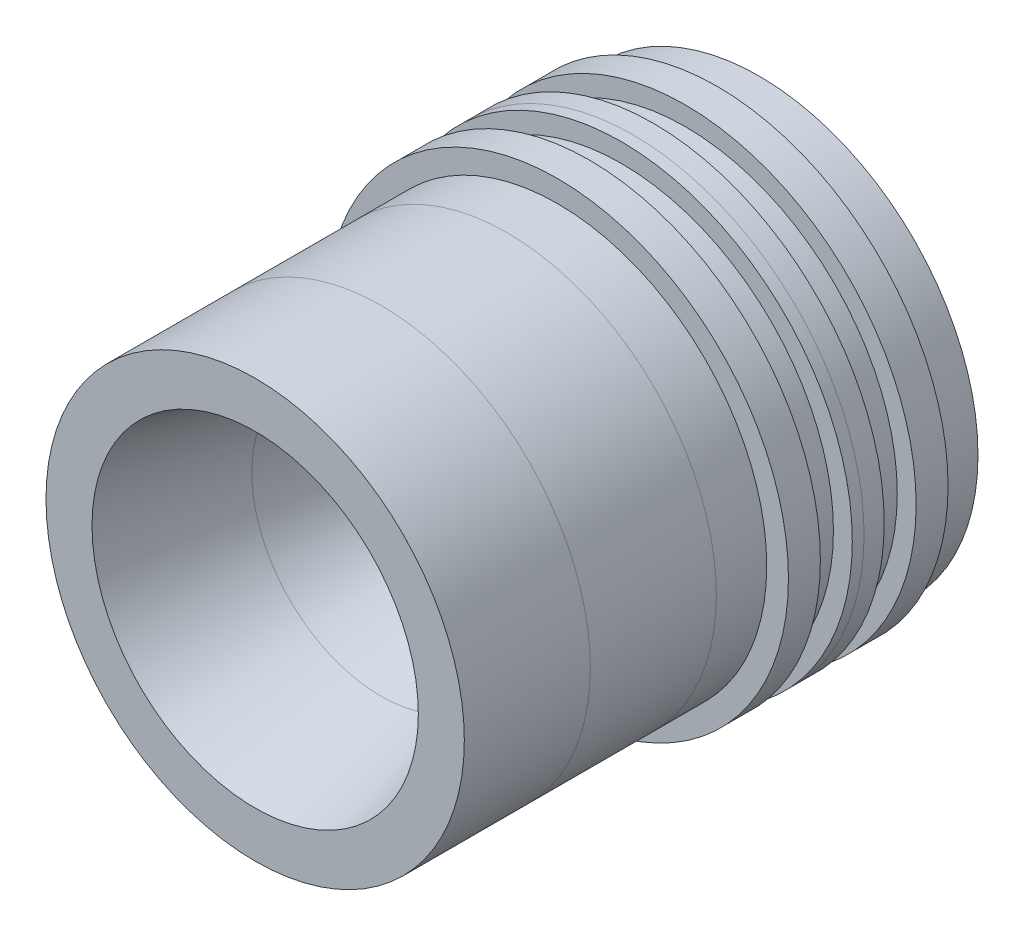
ISO-10303-21;
HEADER;
FILE_DESCRIPTION(('STEP AP214'),'2;1');
FILE_NAME('part.step','',(''),(''),'','','');
FILE_SCHEMA(('AUTOMOTIVE_DESIGN { 1 0 10303 214 1 1 1 1 }'));
ENDSEC;
DATA;
#1=APPLICATION_CONTEXT('core data for automotive mechanical design processes');
#2=APPLICATION_PROTOCOL_DEFINITION('international standard','automotive_design',2000,#1);
#3=PRODUCT_CONTEXT('',#1,'mechanical');
#4=PRODUCT('Part','Part','',(#3));
#5=PRODUCT_RELATED_PRODUCT_CATEGORY('part','',(#4));
#6=PRODUCT_DEFINITION_FORMATION('','',#4);
#7=PRODUCT_DEFINITION_CONTEXT('part definition',#1,'design');
#8=PRODUCT_DEFINITION('design','',#6,#7);
#9=PRODUCT_DEFINITION_SHAPE('','',#8);
#10=(LENGTH_UNIT() NAMED_UNIT(*) SI_UNIT(.MILLI.,.METRE.));
#11=(NAMED_UNIT(*) PLANE_ANGLE_UNIT() SI_UNIT($,.RADIAN.));
#12=(NAMED_UNIT(*) SI_UNIT($,.STERADIAN.) SOLID_ANGLE_UNIT());
#13=UNCERTAINTY_MEASURE_WITH_UNIT(LENGTH_MEASURE(1.E-05),#10,'distance_accuracy_value','');
#14=(GEOMETRIC_REPRESENTATION_CONTEXT(3) GLOBAL_UNCERTAINTY_ASSIGNED_CONTEXT((#13)) GLOBAL_UNIT_ASSIGNED_CONTEXT((#10,
#11,#12)) REPRESENTATION_CONTEXT('',''));
#15=CARTESIAN_POINT('',(0.,0.,0.));
#16=DIRECTION('',(0.,0.,1.));
#17=DIRECTION('',(1.,0.,0.));
#18=AXIS2_PLACEMENT_3D('',#15,#16,#17);
#19=CARTESIAN_POINT('',(0.,0.,-38.1));
#20=DIRECTION('',(0.,0.,1.));
#21=DIRECTION('',(1.,0.,0.));
#22=AXIS2_PLACEMENT_3D('',#19,#20,#21);
#23=PLANE('',#22);
#24=CARTESIAN_POINT('',(0.,0.,-38.1));
#25=DIRECTION('',(0.,0.,1.));
#26=DIRECTION('',(1.,0.,0.));
#27=AXIS2_PLACEMENT_3D('',#24,#25,#26);
#28=CIRCLE('',#27,63.246);
#29=CARTESIAN_POINT('',(63.246,0.,-38.1));
#30=VERTEX_POINT('',#29);
#31=EDGE_CURVE('E51',#30,#30,#28,.F.);
#32=ORIENTED_EDGE('',*,*,#31,.T.);
#33=EDGE_LOOP('',(#32));
#34=FACE_BOUND('',#33,.T.);
#35=CARTESIAN_POINT('',(0.,0.,-38.1));
#36=DIRECTION('',(0.,0.,1.));
#37=DIRECTION('',(1.,0.,0.));
#38=AXIS2_PLACEMENT_3D('',#35,#36,#37);
#39=CIRCLE('',#38,39.1284384748328);
#40=CARTESIAN_POINT('',(39.1284384748328,0.,-38.1));
#41=VERTEX_POINT('',#40);
#42=EDGE_CURVE('E61',#41,#41,#39,.T.);
#43=ORIENTED_EDGE('',*,*,#42,.T.);
#44=EDGE_LOOP('',(#43));
#45=FACE_BOUND('',#44,.T.);
#46=ADVANCED_FACE('F47',(#34,#45),#23,.F.);
#47=CARTESIAN_POINT('',(49.3373027064587,0.,0.));
#48=DIRECTION('',(0.,0.,1.));
#49=DIRECTION('',(1.,0.,0.));
#50=AXIS2_PLACEMENT_3D('',#47,#48,#49);
#51=PLANE('',#50);
#52=CARTESIAN_POINT('',(0.,0.,0.));
#53=DIRECTION('',(0.,0.,1.));
#54=DIRECTION('',(1.,0.,0.));
#55=AXIS2_PLACEMENT_3D('',#52,#53,#54);
#56=CIRCLE('',#55,63.246);
#57=CARTESIAN_POINT('',(63.246,0.,0.));
#58=VERTEX_POINT('',#57);
#59=EDGE_CURVE('E55',#58,#58,#56,.T.);
#60=ORIENTED_EDGE('',*,*,#59,.T.);
#61=EDGE_LOOP('',(#60));
#62=FACE_BOUND('',#61,.T.);
#63=CARTESIAN_POINT('',(0.,0.,0.));
#64=DIRECTION('',(0.,0.,1.));
#65=DIRECTION('',(1.,0.,0.));
#66=AXIS2_PLACEMENT_3D('',#63,#64,#65);
#67=CIRCLE('',#66,49.3373027064587);
#68=CARTESIAN_POINT('',(49.3373027064587,0.,0.));
#69=VERTEX_POINT('',#68);
#70=EDGE_CURVE('E11',#69,#69,#67,.T.);
#71=ORIENTED_EDGE('',*,*,#70,.F.);
#72=EDGE_LOOP('',(#71));
#73=FACE_BOUND('',#72,.T.);
#74=ADVANCED_FACE('F74',(#62,#73),#51,.T.);
#75=CARTESIAN_POINT('',(0.,0.,-120.14330931314));
#76=DIRECTION('',(0.,0.,1.));
#77=DIRECTION('',(1.,0.,0.));
#78=AXIS2_PLACEMENT_3D('',#75,#76,#77);
#79=CONICAL_SURFACE('',#78,17.145,0.26179938779915);
#80=ORIENTED_EDGE('',*,*,#42,.F.);
#81=EDGE_LOOP('',(#80));
#82=FACE_BOUND('',#81,.T.);
#83=ORIENTED_EDGE('',*,*,#70,.T.);
#84=EDGE_LOOP('',(#83));
#85=FACE_BOUND('',#84,.T.);
#86=ADVANCED_FACE('F71',(#82,#85),#79,.F.);
#87=CARTESIAN_POINT('',(0.,0.,8.14522565701556));
#88=DIRECTION('',(0.,0.,1.));
#89=DIRECTION('',(1.,0.,0.));
#90=AXIS2_PLACEMENT_3D('',#87,#88,#89);
#91=CYLINDRICAL_SURFACE('',#90,63.246);
#92=ORIENTED_EDGE('',*,*,#31,.F.);
#93=EDGE_LOOP('',(#92));
#94=FACE_BOUND('',#93,.T.);
#95=ORIENTED_EDGE('',*,*,#59,.F.);
#96=EDGE_LOOP('',(#95));
#97=FACE_BOUND('',#96,.T.);
#98=ADVANCED_FACE('F49',(#94,#97),#91,.T.);
#99=CLOSED_SHELL('',(#46,#74,#86,#98));
#100=MANIFOLD_SOLID_BREP('B2',#99);
#101=CARTESIAN_POINT('',(0.,0.,-114.3));
#102=DIRECTION('',(0.,0.,1.));
#103=DIRECTION('',(1.,0.,0.));
#104=AXIS2_PLACEMENT_3D('',#101,#102,#103);
#105=PLANE('',#104);
#106=CARTESIAN_POINT('',(0.,0.,-114.3));
#107=DIRECTION('',(0.,0.,1.));
#108=DIRECTION('',(1.,0.,0.));
#109=AXIS2_PLACEMENT_3D('',#106,#107,#108);
#110=CIRCLE('',#109,48.6187859076359);
#111=CARTESIAN_POINT('',(48.6187859076359,0.,-114.3));
#112=VERTEX_POINT('',#111);
#113=EDGE_CURVE('E120',#112,#112,#110,.F.);
#114=ORIENTED_EDGE('',*,*,#113,.T.);
#115=EDGE_LOOP('',(#114));
#116=FACE_BOUND('',#115,.T.);
#117=CARTESIAN_POINT('',(0.,0.,-114.3));
#118=DIRECTION('',(0.,0.,1.));
#119=DIRECTION('',(1.,0.,0.));
#120=AXIS2_PLACEMENT_3D('',#117,#118,#119);
#121=CIRCLE('',#120,69.8119);
#122=CARTESIAN_POINT('',(69.8119,0.,-114.3));
#123=VERTEX_POINT('',#122);
#124=EDGE_CURVE('E132',#123,#123,#121,.F.);
#125=ORIENTED_EDGE('',*,*,#124,.F.);
#126=EDGE_LOOP('',(#125));
#127=FACE_BOUND('',#126,.T.);
#128=ADVANCED_FACE('F116',(#116,#127),#105,.T.);
#129=CARTESIAN_POINT('',(69.8119,0.,-139.7));
#130=DIRECTION('',(0.,0.,-1.));
#131=DIRECTION('',(-1.,0.,0.));
#132=AXIS2_PLACEMENT_3D('',#129,#130,#131);
#133=PLANE('',#132);
#134=CARTESIAN_POINT('',(0.,0.,-139.7));
#135=DIRECTION('',(0.,0.,1.));
#136=DIRECTION('',(1.,0.,0.));
#137=AXIS2_PLACEMENT_3D('',#134,#135,#136);
#138=CIRCLE('',#137,66.167);
#139=CARTESIAN_POINT('',(66.167,0.,-139.7));
#140=VERTEX_POINT('',#139);
#141=EDGE_CURVE('E198',#140,#140,#138,.T.);
#142=ORIENTED_EDGE('',*,*,#141,.T.);
#143=EDGE_LOOP('',(#142));
#144=FACE_BOUND('',#143,.T.);
#145=CARTESIAN_POINT('',(0.,0.,-139.7));
#146=DIRECTION('',(0.,0.,1.));
#147=DIRECTION('',(1.,0.,0.));
#148=AXIS2_PLACEMENT_3D('',#145,#146,#147);
#149=CIRCLE('',#148,69.8119);
#150=CARTESIAN_POINT('',(69.8119,0.,-139.7));
#151=VERTEX_POINT('',#150);
#152=EDGE_CURVE('E134',#151,#151,#149,.T.);
#153=ORIENTED_EDGE('',*,*,#152,.F.);
#154=EDGE_LOOP('',(#153));
#155=FACE_BOUND('',#154,.T.);
#156=ADVANCED_FACE('F172',(#144,#155),#133,.T.);
#157=CARTESIAN_POINT('',(0.,0.,8.14522565701556));
#158=DIRECTION('',(0.,0.,1.));
#159=DIRECTION('',(1.,0.,0.));
#160=AXIS2_PLACEMENT_3D('',#157,#158,#159);
#161=CYLINDRICAL_SURFACE('',#160,66.167);
#162=CARTESIAN_POINT('',(0.,0.,-152.4));
#163=DIRECTION('',(0.,0.,1.));
#164=DIRECTION('',(1.,0.,0.));
#165=AXIS2_PLACEMENT_3D('',#162,#163,#164);
#166=CIRCLE('',#165,66.167);
#167=CARTESIAN_POINT('',(66.167,0.,-152.4));
#168=VERTEX_POINT('',#167);
#169=EDGE_CURVE('E203',#168,#168,#166,.T.);
#170=ORIENTED_EDGE('',*,*,#169,.T.);
#171=EDGE_LOOP('',(#170));
#172=FACE_BOUND('',#171,.T.);
#173=ORIENTED_EDGE('',*,*,#141,.F.);
#174=EDGE_LOOP('',(#173));
#175=FACE_BOUND('',#174,.T.);
#176=ADVANCED_FACE('F180',(#172,#175),#161,.T.);
#177=CARTESIAN_POINT('',(66.167,0.,-152.4));
#178=DIRECTION('',(0.,0.,-1.));
#179=DIRECTION('',(-1.,0.,0.));
#180=AXIS2_PLACEMENT_3D('',#177,#178,#179);
#181=PLANE('',#180);
#182=CARTESIAN_POINT('',(0.,0.,-152.4));
#183=DIRECTION('',(0.,0.,1.));
#184=DIRECTION('',(1.,0.,0.));
#185=AXIS2_PLACEMENT_3D('',#182,#183,#184);
#186=CIRCLE('',#185,59.817);
#187=CARTESIAN_POINT('',(59.817,0.,-152.4));
#188=VERTEX_POINT('',#187);
#189=EDGE_CURVE('E138',#188,#188,#186,.T.);
#190=ORIENTED_EDGE('',*,*,#189,.T.);
#191=EDGE_LOOP('',(#190));
#192=FACE_BOUND('',#191,.T.);
#193=ORIENTED_EDGE('',*,*,#169,.F.);
#194=EDGE_LOOP('',(#193));
#195=FACE_BOUND('',#194,.T.);
#196=ADVANCED_FACE('F183',(#192,#195),#181,.T.);
#197=CARTESIAN_POINT('',(0.,0.,-152.4));
#198=DIRECTION('',(0.,0.,-1.));
#199=DIRECTION('',(-1.,0.,0.));
#200=AXIS2_PLACEMENT_3D('',#197,#198,#199);
#201=CONICAL_SURFACE('',#200,59.817,1.0471975511966);
#202=CARTESIAN_POINT('',(0.,0.,-147.194032622717));
#203=DIRECTION('',(0.,0.,1.));
#204=DIRECTION('',(1.,0.,0.));
#205=AXIS2_PLACEMENT_3D('',#202,#203,#204);
#206=CIRCLE('',#205,50.8);
#207=CARTESIAN_POINT('',(50.8,0.,-147.194032622717));
#208=VERTEX_POINT('',#207);
#209=EDGE_CURVE('E46',#208,#208,#206,.T.);
#210=ORIENTED_EDGE('',*,*,#209,.T.);
#211=EDGE_LOOP('',(#210));
#212=FACE_BOUND('',#211,.T.);
#213=ORIENTED_EDGE('',*,*,#189,.F.);
#214=EDGE_LOOP('',(#213));
#215=FACE_BOUND('',#214,.T.);
#216=ADVANCED_FACE('F156',(#212,#215),#201,.F.);
#217=CARTESIAN_POINT('',(0.,0.,8.14522565701556));
#218=DIRECTION('',(0.,0.,1.));
#219=DIRECTION('',(1.,0.,0.));
#220=AXIS2_PLACEMENT_3D('',#217,#218,#219);
#221=CYLINDRICAL_SURFACE('',#220,50.8);
#222=ORIENTED_EDGE('',*,*,#209,.F.);
#223=EDGE_LOOP('',(#222));
#224=FACE_BOUND('',#223,.T.);
#225=CARTESIAN_POINT('',(0.,0.,-126.670279826718));
#226=DIRECTION('',(0.,0.,1.));
#227=DIRECTION('',(1.,0.,0.));
#228=AXIS2_PLACEMENT_3D('',#225,#226,#227);
#229=CIRCLE('',#228,50.8);
#230=CARTESIAN_POINT('',(50.8,0.,-126.670279826718));
#231=VERTEX_POINT('',#230);
#232=EDGE_CURVE('E124',#231,#231,#229,.T.);
#233=ORIENTED_EDGE('',*,*,#232,.T.);
#234=EDGE_LOOP('',(#233));
#235=FACE_BOUND('',#234,.T.);
#236=ADVANCED_FACE('F147',(#224,#235),#221,.F.);
#237=CARTESIAN_POINT('',(0.,0.,-69.85));
#238=DIRECTION('',(0.,0.,-1.));
#239=DIRECTION('',(-1.,0.,0.));
#240=AXIS2_PLACEMENT_3D('',#237,#238,#239);
#241=CONICAL_SURFACE('',#240,40.7810516151447,0.174532925199433);
#242=ORIENTED_EDGE('',*,*,#232,.F.);
#243=EDGE_LOOP('',(#242));
#244=FACE_BOUND('',#243,.T.);
#245=ORIENTED_EDGE('',*,*,#113,.F.);
#246=EDGE_LOOP('',(#245));
#247=FACE_BOUND('',#246,.T.);
#248=ADVANCED_FACE('F118',(#244,#247),#241,.F.);
#249=CARTESIAN_POINT('',(0.,0.,8.14522565701556));
#250=DIRECTION('',(0.,0.,1.));
#251=DIRECTION('',(1.,0.,0.));
#252=AXIS2_PLACEMENT_3D('',#249,#250,#251);
#253=CYLINDRICAL_SURFACE('',#252,69.8119);
#254=CARTESIAN_POINT('',(0.,0.,-130.048));
#255=DIRECTION('',(0.,0.,-1.));
#256=DIRECTION('',(-1.,0.,0.));
#257=AXIS2_PLACEMENT_3D('',#254,#255,#256);
#258=CIRCLE('',#257,69.8119);
#259=CARTESIAN_POINT('',(-69.8119,0.,-130.048));
#260=VERTEX_POINT('',#259);
#261=EDGE_CURVE('E206',#260,#260,#258,.F.);
#262=ORIENTED_EDGE('',*,*,#261,.F.);
#263=EDGE_LOOP('',(#262));
#264=FACE_BOUND('',#263,.T.);
#265=ORIENTED_EDGE('',*,*,#152,.T.);
#266=EDGE_LOOP('',(#265));
#267=FACE_BOUND('',#266,.T.);
#268=ADVANCED_FACE('F146',(#264,#267),#253,.T.);
#269=CARTESIAN_POINT('',(64.1096,0.,-130.048));
#270=DIRECTION('',(0.,0.,-1.));
#271=DIRECTION('',(-1.,0.,0.));
#272=AXIS2_PLACEMENT_3D('',#269,#270,#271);
#273=PLANE('',#272);
#274=ORIENTED_EDGE('',*,*,#261,.T.);
#275=EDGE_LOOP('',(#274));
#276=FACE_BOUND('',#275,.T.);
#277=CARTESIAN_POINT('',(0.,0.,-130.048));
#278=DIRECTION('',(0.,0.,1.));
#279=DIRECTION('',(1.,0.,0.));
#280=AXIS2_PLACEMENT_3D('',#277,#278,#279);
#281=CIRCLE('',#280,64.1096);
#282=CARTESIAN_POINT('',(64.1096,0.,-130.048));
#283=VERTEX_POINT('',#282);
#284=EDGE_CURVE('E129',#283,#283,#281,.T.);
#285=ORIENTED_EDGE('',*,*,#284,.F.);
#286=EDGE_LOOP('',(#285));
#287=FACE_BOUND('',#286,.T.);
#288=ADVANCED_FACE('F153',(#276,#287),#273,.F.);
#289=CARTESIAN_POINT('',(0.,0.,8.14522565701556));
#290=DIRECTION('',(0.,0.,1.));
#291=DIRECTION('',(1.,0.,0.));
#292=AXIS2_PLACEMENT_3D('',#289,#290,#291);
#293=CYLINDRICAL_SURFACE('',#292,64.1096);
#294=CARTESIAN_POINT('',(0.,0.,-120.396));
#295=DIRECTION('',(0.,0.,1.));
#296=DIRECTION('',(1.,0.,0.));
#297=AXIS2_PLACEMENT_3D('',#294,#295,#296);
#298=CIRCLE('',#297,64.1096);
#299=CARTESIAN_POINT('',(64.1096,0.,-120.396));
#300=VERTEX_POINT('',#299);
#301=EDGE_CURVE('E212',#300,#300,#298,.T.);
#302=ORIENTED_EDGE('',*,*,#301,.F.);
#303=EDGE_LOOP('',(#302));
#304=FACE_BOUND('',#303,.T.);
#305=ORIENTED_EDGE('',*,*,#284,.T.);
#306=EDGE_LOOP('',(#305));
#307=FACE_BOUND('',#306,.T.);
#308=ADVANCED_FACE('F166',(#304,#307),#293,.T.);
#309=CARTESIAN_POINT('',(64.1096,0.,-120.396));
#310=DIRECTION('',(0.,0.,1.));
#311=DIRECTION('',(1.,0.,0.));
#312=AXIS2_PLACEMENT_3D('',#309,#310,#311);
#313=PLANE('',#312);
#314=CARTESIAN_POINT('',(0.,0.,-120.396));
#315=DIRECTION('',(0.,0.,1.));
#316=DIRECTION('',(1.,0.,0.));
#317=AXIS2_PLACEMENT_3D('',#314,#315,#316);
#318=CIRCLE('',#317,69.8119);
#319=CARTESIAN_POINT('',(69.8119,0.,-120.396));
#320=VERTEX_POINT('',#319);
#321=EDGE_CURVE('E202',#320,#320,#318,.F.);
#322=ORIENTED_EDGE('',*,*,#321,.T.);
#323=EDGE_LOOP('',(#322));
#324=FACE_BOUND('',#323,.T.);
#325=ORIENTED_EDGE('',*,*,#301,.T.);
#326=EDGE_LOOP('',(#325));
#327=FACE_BOUND('',#326,.T.);
#328=ADVANCED_FACE('F161',(#324,#327),#313,.F.);
#329=ORIENTED_EDGE('',*,*,#321,.F.);
#330=EDGE_LOOP('',(#329));
#331=FACE_BOUND('',#330,.T.);
#332=ORIENTED_EDGE('',*,*,#124,.T.);
#333=EDGE_LOOP('',(#332));
#334=FACE_BOUND('',#333,.T.);
#335=ADVANCED_FACE('F155',(#331,#334),#253,.T.);
#336=CLOSED_SHELL('',(#128,#156,#176,#196,#216,#236,#248,#268,#288,#308,#328,#335));
#337=MANIFOLD_SOLID_BREP('B6',#336);
#338=CARTESIAN_POINT('',(0.,0.,-76.2));
#339=DIRECTION('',(0.,0.,1.));
#340=DIRECTION('',(1.,0.,0.));
#341=AXIS2_PLACEMENT_3D('',#338,#339,#340);
#342=PLANE('',#341);
#343=CARTESIAN_POINT('',(0.,0.,-76.2));
#344=DIRECTION('',(0.,0.,1.));
#345=DIRECTION('',(1.,0.,0.));
#346=AXIS2_PLACEMENT_3D('',#343,#344,#345);
#347=CIRCLE('',#346,63.246);
#348=CARTESIAN_POINT('',(63.246,0.,-76.2));
#349=VERTEX_POINT('',#348);
#350=EDGE_CURVE('E307',#349,#349,#347,.F.);
#351=ORIENTED_EDGE('',*,*,#350,.T.);
#352=EDGE_LOOP('',(#351));
#353=FACE_BOUND('',#352,.T.);
#354=CARTESIAN_POINT('',(0.,0.,-76.2));
#355=DIRECTION('',(0.,0.,1.));
#356=DIRECTION('',(1.,0.,0.));
#357=AXIS2_PLACEMENT_3D('',#354,#355,#356);
#358=CIRCLE('',#357,41.9007279426434);
#359=CARTESIAN_POINT('',(41.9007279426434,0.,-76.2));
#360=VERTEX_POINT('',#359);
#361=EDGE_CURVE('E318',#360,#360,#358,.F.);
#362=ORIENTED_EDGE('',*,*,#361,.F.);
#363=EDGE_LOOP('',(#362));
#364=FACE_BOUND('',#363,.T.);
#365=ADVANCED_FACE('F303',(#353,#364),#342,.F.);
#366=CARTESIAN_POINT('',(0.,0.,-38.1));
#367=DIRECTION('',(0.,0.,1.));
#368=DIRECTION('',(1.,0.,0.));
#369=AXIS2_PLACEMENT_3D('',#366,#367,#368);
#370=PLANE('',#369);
#371=CARTESIAN_POINT('',(0.,0.,-38.1));
#372=DIRECTION('',(0.,0.,1.));
#373=DIRECTION('',(1.,0.,0.));
#374=AXIS2_PLACEMENT_3D('',#371,#372,#373);
#375=CIRCLE('',#374,39.1284384748328);
#376=CARTESIAN_POINT('',(39.1284384748328,0.,-38.1));
#377=VERTEX_POINT('',#376);
#378=EDGE_CURVE('E323',#377,#377,#375,.T.);
#379=ORIENTED_EDGE('',*,*,#378,.F.);
#380=EDGE_LOOP('',(#379));
#381=FACE_BOUND('',#380,.T.);
#382=CARTESIAN_POINT('',(0.,0.,-38.1));
#383=DIRECTION('',(0.,0.,1.));
#384=DIRECTION('',(1.,0.,0.));
#385=AXIS2_PLACEMENT_3D('',#382,#383,#384);
#386=CIRCLE('',#385,63.246);
#387=CARTESIAN_POINT('',(63.246,0.,-38.1));
#388=VERTEX_POINT('',#387);
#389=EDGE_CURVE('E328',#388,#388,#386,.F.);
#390=ORIENTED_EDGE('',*,*,#389,.F.);
#391=EDGE_LOOP('',(#390));
#392=FACE_BOUND('',#391,.T.);
#393=ADVANCED_FACE('F344',(#381,#392),#370,.T.);
#394=CARTESIAN_POINT('',(40.7810516151447,0.,-69.85));
#395=DIRECTION('',(0.,0.,1.));
#396=DIRECTION('',(1.,0.,0.));
#397=AXIS2_PLACEMENT_3D('',#394,#395,#396);
#398=PLANE('',#397);
#399=CARTESIAN_POINT('',(0.,0.,-69.85));
#400=DIRECTION('',(0.,0.,1.));
#401=DIRECTION('',(1.,0.,0.));
#402=AXIS2_PLACEMENT_3D('',#399,#400,#401);
#403=CIRCLE('',#402,40.7810516151447);
#404=CARTESIAN_POINT('',(40.7810516151447,0.,-69.85));
#405=VERTEX_POINT('',#404);
#406=EDGE_CURVE('E115',#405,#405,#403,.T.);
#407=ORIENTED_EDGE('',*,*,#406,.F.);
#408=EDGE_LOOP('',(#407));
#409=FACE_BOUND('',#408,.T.);
#410=CARTESIAN_POINT('',(0.,0.,-69.85));
#411=DIRECTION('',(0.,0.,1.));
#412=DIRECTION('',(1.,0.,0.));
#413=AXIS2_PLACEMENT_3D('',#410,#411,#412);
#414=CIRCLE('',#413,30.6210516151447);
#415=CARTESIAN_POINT('',(30.6210516151447,0.,-69.85));
#416=VERTEX_POINT('',#415);
#417=EDGE_CURVE('E312',#416,#416,#414,.T.);
#418=ORIENTED_EDGE('',*,*,#417,.T.);
#419=EDGE_LOOP('',(#418));
#420=FACE_BOUND('',#419,.T.);
#421=ADVANCED_FACE('F351',(#409,#420),#398,.F.);
#422=CARTESIAN_POINT('',(0.,0.,-69.85));
#423=DIRECTION('',(0.,0.,-1.));
#424=DIRECTION('',(-1.,0.,0.));
#425=AXIS2_PLACEMENT_3D('',#422,#423,#424);
#426=CONICAL_SURFACE('',#425,40.7810516151447,0.174532925199433);
#427=ORIENTED_EDGE('',*,*,#361,.T.);
#428=EDGE_LOOP('',(#427));
#429=FACE_BOUND('',#428,.T.);
#430=ORIENTED_EDGE('',*,*,#406,.T.);
#431=EDGE_LOOP('',(#430));
#432=FACE_BOUND('',#431,.T.);
#433=ADVANCED_FACE('F348',(#429,#432),#426,.F.);
#434=CARTESIAN_POINT('',(0.,0.,-120.14330931314));
#435=DIRECTION('',(0.,0.,1.));
#436=DIRECTION('',(1.,0.,0.));
#437=AXIS2_PLACEMENT_3D('',#434,#435,#436);
#438=CONICAL_SURFACE('',#437,17.145,0.26179938779915);
#439=ORIENTED_EDGE('',*,*,#417,.F.);
#440=EDGE_LOOP('',(#439));
#441=FACE_BOUND('',#440,.T.);
#442=ORIENTED_EDGE('',*,*,#378,.T.);
#443=EDGE_LOOP('',(#442));
#444=FACE_BOUND('',#443,.T.);
#445=ADVANCED_FACE('F343',(#441,#444),#438,.F.);
#446=CARTESIAN_POINT('',(0.,0.,8.14522565701556));
#447=DIRECTION('',(0.,0.,1.));
#448=DIRECTION('',(1.,0.,0.));
#449=AXIS2_PLACEMENT_3D('',#446,#447,#448);
#450=CYLINDRICAL_SURFACE('',#449,63.246);
#451=ORIENTED_EDGE('',*,*,#350,.F.);
#452=EDGE_LOOP('',(#451));
#453=FACE_BOUND('',#452,.T.);
#454=ORIENTED_EDGE('',*,*,#389,.T.);
#455=EDGE_LOOP('',(#454));
#456=FACE_BOUND('',#455,.T.);
#457=ADVANCED_FACE('F305',(#453,#456),#450,.T.);
#458=CLOSED_SHELL('',(#365,#393,#421,#433,#445,#457));
#459=MANIFOLD_SOLID_BREP('B41',#458);
#460=CARTESIAN_POINT('',(0.,0.,-114.3));
#461=DIRECTION('',(0.,0.,1.));
#462=DIRECTION('',(1.,0.,0.));
#463=AXIS2_PLACEMENT_3D('',#460,#461,#462);
#464=PLANE('',#463);
#465=CARTESIAN_POINT('',(0.,0.,-114.3));
#466=DIRECTION('',(0.,0.,1.));
#467=DIRECTION('',(1.,0.,0.));
#468=AXIS2_PLACEMENT_3D('',#465,#466,#467);
#469=CIRCLE('',#468,69.8119);
#470=CARTESIAN_POINT('',(69.8119,0.,-114.3));
#471=VERTEX_POINT('',#470);
#472=EDGE_CURVE('E404',#471,#471,#469,.F.);
#473=ORIENTED_EDGE('',*,*,#472,.T.);
#474=EDGE_LOOP('',(#473));
#475=FACE_BOUND('',#474,.T.);
#476=CARTESIAN_POINT('',(0.,0.,-114.3));
#477=DIRECTION('',(0.,0.,1.));
#478=DIRECTION('',(1.,0.,0.));
#479=AXIS2_PLACEMENT_3D('',#476,#477,#478);
#480=CIRCLE('',#479,48.6187859076359);
#481=CARTESIAN_POINT('',(48.6187859076359,0.,-114.3));
#482=VERTEX_POINT('',#481);
#483=EDGE_CURVE('E417',#482,#482,#480,.F.);
#484=ORIENTED_EDGE('',*,*,#483,.F.);
#485=EDGE_LOOP('',(#484));
#486=FACE_BOUND('',#485,.T.);
#487=ADVANCED_FACE('F400',(#475,#486),#464,.F.);
#488=CARTESIAN_POINT('',(0.,0.,-76.2));
#489=DIRECTION('',(0.,0.,1.));
#490=DIRECTION('',(1.,0.,0.));
#491=AXIS2_PLACEMENT_3D('',#488,#489,#490);
#492=PLANE('',#491);
#493=CARTESIAN_POINT('',(0.,0.,-76.2));
#494=DIRECTION('',(0.,0.,1.));
#495=DIRECTION('',(1.,0.,0.));
#496=AXIS2_PLACEMENT_3D('',#493,#494,#495);
#497=CIRCLE('',#496,41.9007279426434);
#498=CARTESIAN_POINT('',(41.9007279426434,0.,-76.2));
#499=VERTEX_POINT('',#498);
#500=EDGE_CURVE('E302',#499,#499,#497,.F.);
#501=ORIENTED_EDGE('',*,*,#500,.T.);
#502=EDGE_LOOP('',(#501));
#503=FACE_BOUND('',#502,.T.);
#504=CARTESIAN_POINT('',(0.,0.,-76.2));
#505=DIRECTION('',(0.,0.,1.));
#506=DIRECTION('',(1.,0.,0.));
#507=AXIS2_PLACEMENT_3D('',#504,#505,#506);
#508=CIRCLE('',#507,63.246);
#509=CARTESIAN_POINT('',(63.246,0.,-76.2));
#510=VERTEX_POINT('',#509);
#511=EDGE_CURVE('E412',#510,#510,#508,.F.);
#512=ORIENTED_EDGE('',*,*,#511,.F.);
#513=EDGE_LOOP('',(#512));
#514=FACE_BOUND('',#513,.T.);
#515=ADVANCED_FACE('F402',(#503,#514),#492,.T.);
#516=CARTESIAN_POINT('',(0.,0.,-69.85));
#517=DIRECTION('',(0.,0.,-1.));
#518=DIRECTION('',(-1.,0.,0.));
#519=AXIS2_PLACEMENT_3D('',#516,#517,#518);
#520=CONICAL_SURFACE('',#519,40.7810516151447,0.174532925199433);
#521=ORIENTED_EDGE('',*,*,#483,.T.);
#522=EDGE_LOOP('',(#521));
#523=FACE_BOUND('',#522,.T.);
#524=ORIENTED_EDGE('',*,*,#500,.F.);
#525=EDGE_LOOP('',(#524));
#526=FACE_BOUND('',#525,.T.);
#527=ADVANCED_FACE('F426',(#523,#526),#520,.F.);
#528=CARTESIAN_POINT('',(64.1096,0.,-101.092));
#529=DIRECTION('',(0.,0.,1.));
#530=DIRECTION('',(1.,0.,0.));
#531=AXIS2_PLACEMENT_3D('',#528,#529,#530);
#532=PLANE('',#531);
#533=CARTESIAN_POINT('',(0.,0.,-101.092));
#534=DIRECTION('',(0.,0.,1.));
#535=DIRECTION('',(1.,0.,0.));
#536=AXIS2_PLACEMENT_3D('',#533,#534,#535);
#537=CIRCLE('',#536,69.8119);
#538=CARTESIAN_POINT('',(69.8119,0.,-101.092));
#539=VERTEX_POINT('',#538);
#540=EDGE_CURVE('E415',#539,#539,#537,.F.);
#541=ORIENTED_EDGE('',*,*,#540,.T.);
#542=EDGE_LOOP('',(#541));
#543=FACE_BOUND('',#542,.T.);
#544=CARTESIAN_POINT('',(0.,0.,-101.092));
#545=DIRECTION('',(0.,0.,1.));
#546=DIRECTION('',(1.,0.,0.));
#547=AXIS2_PLACEMENT_3D('',#544,#545,#546);
#548=CIRCLE('',#547,64.1096);
#549=CARTESIAN_POINT('',(64.1096,0.,-101.092));
#550=VERTEX_POINT('',#549);
#551=EDGE_CURVE('E466',#550,#550,#548,.T.);
#552=ORIENTED_EDGE('',*,*,#551,.T.);
#553=EDGE_LOOP('',(#552));
#554=FACE_BOUND('',#553,.T.);
#555=ADVANCED_FACE('F431',(#543,#554),#532,.F.);
#556=CARTESIAN_POINT('',(0.,0.,8.14522565701556));
#557=DIRECTION('',(0.,0.,1.));
#558=DIRECTION('',(1.,0.,0.));
#559=AXIS2_PLACEMENT_3D('',#556,#557,#558);
#560=CYLINDRICAL_SURFACE('',#559,64.1096);
#561=ORIENTED_EDGE('',*,*,#551,.F.);
#562=EDGE_LOOP('',(#561));
#563=FACE_BOUND('',#562,.T.);
#564=CARTESIAN_POINT('',(0.,0.,-110.744));
#565=DIRECTION('',(0.,0.,1.));
#566=DIRECTION('',(1.,0.,0.));
#567=AXIS2_PLACEMENT_3D('',#564,#565,#566);
#568=CIRCLE('',#567,64.1096);
#569=CARTESIAN_POINT('',(64.1096,0.,-110.744));
#570=VERTEX_POINT('',#569);
#571=EDGE_CURVE('E470',#570,#570,#568,.T.);
#572=ORIENTED_EDGE('',*,*,#571,.T.);
#573=EDGE_LOOP('',(#572));
#574=FACE_BOUND('',#573,.T.);
#575=ADVANCED_FACE('F448',(#563,#574),#560,.T.);
#576=CARTESIAN_POINT('',(64.1096,0.,-110.744));
#577=DIRECTION('',(0.,0.,-1.));
#578=DIRECTION('',(-1.,0.,0.));
#579=AXIS2_PLACEMENT_3D('',#576,#577,#578);
#580=PLANE('',#579);
#581=CARTESIAN_POINT('',(0.,0.,-110.744));
#582=DIRECTION('',(0.,0.,-1.));
#583=DIRECTION('',(-1.,0.,0.));
#584=AXIS2_PLACEMENT_3D('',#581,#582,#583);
#585=CIRCLE('',#584,69.8119);
#586=CARTESIAN_POINT('',(-69.8119,0.,-110.744));
#587=VERTEX_POINT('',#586);
#588=EDGE_CURVE('E465',#587,#587,#585,.F.);
#589=ORIENTED_EDGE('',*,*,#588,.T.);
#590=EDGE_LOOP('',(#589));
#591=FACE_BOUND('',#590,.T.);
#592=ORIENTED_EDGE('',*,*,#571,.F.);
#593=EDGE_LOOP('',(#592));
#594=FACE_BOUND('',#593,.T.);
#595=ADVANCED_FACE('F452',(#591,#594),#580,.F.);
#596=CARTESIAN_POINT('',(0.,0.,8.14522565701556));
#597=DIRECTION('',(0.,0.,1.));
#598=DIRECTION('',(1.,0.,0.));
#599=AXIS2_PLACEMENT_3D('',#596,#597,#598);
#600=CYLINDRICAL_SURFACE('',#599,69.8119);
#601=ORIENTED_EDGE('',*,*,#472,.F.);
#602=EDGE_LOOP('',(#601));
#603=FACE_BOUND('',#602,.T.);
#604=ORIENTED_EDGE('',*,*,#588,.F.);
#605=EDGE_LOOP('',(#604));
#606=FACE_BOUND('',#605,.T.);
#607=ADVANCED_FACE('F451',(#603,#606),#600,.T.);
#608=ORIENTED_EDGE('',*,*,#540,.F.);
#609=EDGE_LOOP('',(#608));
#610=FACE_BOUND('',#609,.T.);
#611=CARTESIAN_POINT('',(0.,0.,-91.44));
#612=DIRECTION('',(0.,0.,1.));
#613=DIRECTION('',(1.,0.,0.));
#614=AXIS2_PLACEMENT_3D('',#611,#612,#613);
#615=CIRCLE('',#614,69.8119);
#616=CARTESIAN_POINT('',(69.8119,0.,-91.44));
#617=VERTEX_POINT('',#616);
#618=EDGE_CURVE('E419',#617,#617,#615,.T.);
#619=ORIENTED_EDGE('',*,*,#618,.F.);
#620=EDGE_LOOP('',(#619));
#621=FACE_BOUND('',#620,.T.);
#622=ADVANCED_FACE('F443',(#610,#621),#600,.T.);
#623=CARTESIAN_POINT('',(63.246,0.,-91.44));
#624=DIRECTION('',(0.,0.,1.));
#625=DIRECTION('',(1.,0.,0.));
#626=AXIS2_PLACEMENT_3D('',#623,#624,#625);
#627=PLANE('',#626);
#628=ORIENTED_EDGE('',*,*,#618,.T.);
#629=EDGE_LOOP('',(#628));
#630=FACE_BOUND('',#629,.T.);
#631=CARTESIAN_POINT('',(0.,0.,-91.44));
#632=DIRECTION('',(0.,0.,1.));
#633=DIRECTION('',(1.,0.,0.));
#634=AXIS2_PLACEMENT_3D('',#631,#632,#633);
#635=CIRCLE('',#634,63.246);
#636=CARTESIAN_POINT('',(63.246,0.,-91.44));
#637=VERTEX_POINT('',#636);
#638=EDGE_CURVE('E468',#637,#637,#635,.T.);
#639=ORIENTED_EDGE('',*,*,#638,.F.);
#640=EDGE_LOOP('',(#639));
#641=FACE_BOUND('',#640,.T.);
#642=ADVANCED_FACE('F436',(#630,#641),#627,.T.);
#643=CARTESIAN_POINT('',(0.,0.,8.14522565701556));
#644=DIRECTION('',(0.,0.,1.));
#645=DIRECTION('',(1.,0.,0.));
#646=AXIS2_PLACEMENT_3D('',#643,#644,#645);
#647=CYLINDRICAL_SURFACE('',#646,63.246);
#648=ORIENTED_EDGE('',*,*,#638,.T.);
#649=EDGE_LOOP('',(#648));
#650=FACE_BOUND('',#649,.T.);
#651=ORIENTED_EDGE('',*,*,#511,.T.);
#652=EDGE_LOOP('',(#651));
#653=FACE_BOUND('',#652,.T.);
#654=ADVANCED_FACE('F423',(#650,#653),#647,.T.);
#655=CLOSED_SHELL('',(#487,#515,#527,#555,#575,#595,#607,#622,#642,#654));
#656=MANIFOLD_SOLID_BREP('B110',#655);
#657=ADVANCED_BREP_SHAPE_REPRESENTATION('',(#18,#100,#337,#459,#656),#14);
#658=SHAPE_DEFINITION_REPRESENTATION(#9,#657);
ENDSEC;
END-ISO-10303-21;
